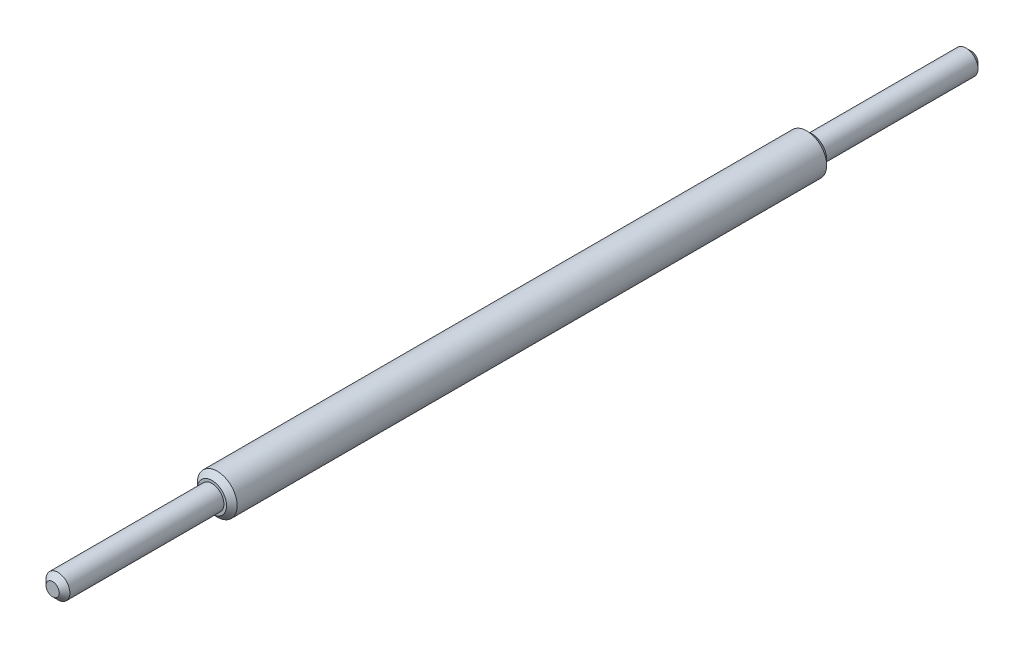
ISO-10303-21;
HEADER;
FILE_DESCRIPTION(('STEP AP214'),'2;1');
FILE_NAME('part.step','',(''),(''),'','','');
FILE_SCHEMA(('AUTOMOTIVE_DESIGN { 1 0 10303 214 1 1 1 1 }'));
ENDSEC;
DATA;
#1=APPLICATION_CONTEXT('core data for automotive mechanical design processes');
#2=APPLICATION_PROTOCOL_DEFINITION('international standard','automotive_design',2000,#1);
#3=PRODUCT_CONTEXT('',#1,'mechanical');
#4=PRODUCT('Part','Part','',(#3));
#5=PRODUCT_RELATED_PRODUCT_CATEGORY('part','',(#4));
#6=PRODUCT_DEFINITION_FORMATION('','',#4);
#7=PRODUCT_DEFINITION_CONTEXT('part definition',#1,'design');
#8=PRODUCT_DEFINITION('design','',#6,#7);
#9=PRODUCT_DEFINITION_SHAPE('','',#8);
#10=(LENGTH_UNIT() NAMED_UNIT(*) SI_UNIT(.MILLI.,.METRE.));
#11=(NAMED_UNIT(*) PLANE_ANGLE_UNIT() SI_UNIT($,.RADIAN.));
#12=(NAMED_UNIT(*) SI_UNIT($,.STERADIAN.) SOLID_ANGLE_UNIT());
#13=UNCERTAINTY_MEASURE_WITH_UNIT(LENGTH_MEASURE(1.E-05),#10,'distance_accuracy_value','');
#14=(GEOMETRIC_REPRESENTATION_CONTEXT(3) GLOBAL_UNCERTAINTY_ASSIGNED_CONTEXT((#13)) GLOBAL_UNIT_ASSIGNED_CONTEXT((#10,
#11,#12)) REPRESENTATION_CONTEXT('',''));
#15=CARTESIAN_POINT('',(0.,0.,0.));
#16=DIRECTION('',(0.,0.,1.));
#17=DIRECTION('',(1.,0.,0.));
#18=AXIS2_PLACEMENT_3D('',#15,#16,#17);
#19=CARTESIAN_POINT('',(0.,0.,173.));
#20=DIRECTION('',(0.,0.,-1.));
#21=DIRECTION('',(-1.,0.,0.));
#22=AXIS2_PLACEMENT_3D('',#19,#20,#21);
#23=CYLINDRICAL_SURFACE('',#22,4.5);
#24=CARTESIAN_POINT('',(0.,0.,171.));
#25=DIRECTION('',(0.,0.,1.));
#26=DIRECTION('',(1.,0.,0.));
#27=AXIS2_PLACEMENT_3D('',#24,#25,#26);
#28=CIRCLE('',#27,4.5);
#29=CARTESIAN_POINT('',(4.5,0.,171.));
#30=VERTEX_POINT('',#29);
#31=EDGE_CURVE('E58',#30,#30,#28,.F.);
#32=ORIENTED_EDGE('',*,*,#31,.T.);
#33=EDGE_LOOP('',(#32));
#34=FACE_BOUND('',#33,.T.);
#35=CARTESIAN_POINT('',(0.,0.,113.));
#36=DIRECTION('',(0.,0.,1.));
#37=DIRECTION('',(1.,0.,0.));
#38=AXIS2_PLACEMENT_3D('',#35,#36,#37);
#39=CIRCLE('',#38,4.5);
#40=CARTESIAN_POINT('',(4.5,0.,113.));
#41=VERTEX_POINT('',#40);
#42=EDGE_CURVE('E71',#41,#41,#39,.T.);
#43=ORIENTED_EDGE('',*,*,#42,.T.);
#44=EDGE_LOOP('',(#43));
#45=FACE_BOUND('',#44,.T.);
#46=ADVANCED_FACE('F37',(#34,#45),#23,.T.);
#47=CARTESIAN_POINT('',(0.,0.,173.));
#48=DIRECTION('',(0.,0.,1.));
#49=DIRECTION('',(1.,0.,0.));
#50=AXIS2_PLACEMENT_3D('',#47,#48,#49);
#51=PLANE('',#50);
#52=CARTESIAN_POINT('',(0.,0.,173.));
#53=DIRECTION('',(0.,0.,1.));
#54=DIRECTION('',(1.,0.,0.));
#55=AXIS2_PLACEMENT_3D('',#52,#53,#54);
#56=CIRCLE('',#55,2.5);
#57=CARTESIAN_POINT('',(2.5,0.,173.));
#58=VERTEX_POINT('',#57);
#59=EDGE_CURVE('E61',#58,#58,#56,.T.);
#60=ORIENTED_EDGE('',*,*,#59,.T.);
#61=EDGE_LOOP('',(#60));
#62=FACE_BOUND('',#61,.T.);
#63=ADVANCED_FACE('F95',(#62),#51,.T.);
#64=CARTESIAN_POINT('',(0.,0.,-194.213203435596));
#65=DIRECTION('',(0.,0.,1.));
#66=DIRECTION('',(1.,0.,0.));
#67=AXIS2_PLACEMENT_3D('',#64,#65,#66);
#68=CYLINDRICAL_SURFACE('',#67,7.5);
#69=CARTESIAN_POINT('',(0.,0.,-111.));
#70=DIRECTION('',(0.,0.,1.));
#71=DIRECTION('',(1.,0.,0.));
#72=AXIS2_PLACEMENT_3D('',#69,#70,#71);
#73=CIRCLE('',#72,7.5);
#74=CARTESIAN_POINT('',(7.5,0.,-111.));
#75=VERTEX_POINT('',#74);
#76=EDGE_CURVE('E45',#75,#75,#73,.T.);
#77=ORIENTED_EDGE('',*,*,#76,.T.);
#78=EDGE_LOOP('',(#77));
#79=FACE_BOUND('',#78,.T.);
#80=CARTESIAN_POINT('',(0.,0.,111.));
#81=DIRECTION('',(0.,0.,1.));
#82=DIRECTION('',(1.,0.,0.));
#83=AXIS2_PLACEMENT_3D('',#80,#81,#82);
#84=CIRCLE('',#83,7.5);
#85=CARTESIAN_POINT('',(7.5,0.,111.));
#86=VERTEX_POINT('',#85);
#87=EDGE_CURVE('E49',#86,#86,#84,.F.);
#88=ORIENTED_EDGE('',*,*,#87,.T.);
#89=EDGE_LOOP('',(#88));
#90=FACE_BOUND('',#89,.T.);
#91=ADVANCED_FACE('F100',(#79,#90),#68,.T.);
#92=CARTESIAN_POINT('',(0.,0.,113.));
#93=DIRECTION('',(0.,0.,1.));
#94=DIRECTION('',(1.,0.,0.));
#95=AXIS2_PLACEMENT_3D('',#92,#93,#94);
#96=PLANE('',#95);
#97=CARTESIAN_POINT('',(0.,0.,113.));
#98=DIRECTION('',(0.,0.,1.));
#99=DIRECTION('',(1.,0.,0.));
#100=AXIS2_PLACEMENT_3D('',#97,#98,#99);
#101=CIRCLE('',#100,5.49999999999992);
#102=CARTESIAN_POINT('',(5.49999999999992,0.,113.));
#103=VERTEX_POINT('',#102);
#104=EDGE_CURVE('E11',#103,#103,#101,.T.);
#105=ORIENTED_EDGE('',*,*,#104,.T.);
#106=EDGE_LOOP('',(#105));
#107=FACE_BOUND('',#106,.T.);
#108=ORIENTED_EDGE('',*,*,#42,.F.);
#109=EDGE_LOOP('',(#108));
#110=FACE_BOUND('',#109,.T.);
#111=ADVANCED_FACE('F107',(#107,#110),#96,.T.);
#112=CARTESIAN_POINT('',(0.,0.,-113.));
#113=DIRECTION('',(0.,0.,1.));
#114=DIRECTION('',(1.,0.,0.));
#115=AXIS2_PLACEMENT_3D('',#112,#113,#114);
#116=PLANE('',#115);
#117=CARTESIAN_POINT('',(0.,0.,-113.));
#118=DIRECTION('',(0.,0.,1.));
#119=DIRECTION('',(1.,0.,0.));
#120=AXIS2_PLACEMENT_3D('',#117,#118,#119);
#121=CIRCLE('',#120,5.49999999999992);
#122=CARTESIAN_POINT('',(5.49999999999992,0.,-113.));
#123=VERTEX_POINT('',#122);
#124=EDGE_CURVE('E53',#123,#123,#121,.F.);
#125=ORIENTED_EDGE('',*,*,#124,.T.);
#126=EDGE_LOOP('',(#125));
#127=FACE_BOUND('',#126,.T.);
#128=CARTESIAN_POINT('',(0.,0.,-113.));
#129=DIRECTION('',(0.,0.,1.));
#130=DIRECTION('',(1.,0.,0.));
#131=AXIS2_PLACEMENT_3D('',#128,#129,#130);
#132=CIRCLE('',#131,4.5);
#133=CARTESIAN_POINT('',(4.5,0.,-113.));
#134=VERTEX_POINT('',#133);
#135=EDGE_CURVE('E70',#134,#134,#132,.T.);
#136=ORIENTED_EDGE('',*,*,#135,.T.);
#137=EDGE_LOOP('',(#136));
#138=FACE_BOUND('',#137,.T.);
#139=ADVANCED_FACE('F77',(#127,#138),#116,.F.);
#140=CARTESIAN_POINT('',(0.,0.,-173.));
#141=DIRECTION('',(0.,0.,1.));
#142=DIRECTION('',(1.,0.,0.));
#143=AXIS2_PLACEMENT_3D('',#140,#141,#142);
#144=PLANE('',#143);
#145=CARTESIAN_POINT('',(0.,0.,-173.));
#146=DIRECTION('',(0.,0.,1.));
#147=DIRECTION('',(1.,0.,0.));
#148=AXIS2_PLACEMENT_3D('',#145,#146,#147);
#149=CIRCLE('',#148,2.49999999999992);
#150=CARTESIAN_POINT('',(2.49999999999992,0.,-173.));
#151=VERTEX_POINT('',#150);
#152=EDGE_CURVE('E64',#151,#151,#149,.F.);
#153=ORIENTED_EDGE('',*,*,#152,.T.);
#154=EDGE_LOOP('',(#153));
#155=FACE_BOUND('',#154,.T.);
#156=ADVANCED_FACE('F82',(#155),#144,.F.);
#157=CARTESIAN_POINT('',(0.,0.,-171.));
#158=DIRECTION('',(0.,0.,1.));
#159=DIRECTION('',(1.,0.,0.));
#160=AXIS2_PLACEMENT_3D('',#157,#158,#159);
#161=CIRCLE('',#160,4.5);
#162=CARTESIAN_POINT('',(4.5,0.,-171.));
#163=VERTEX_POINT('',#162);
#164=EDGE_CURVE('E67',#163,#163,#161,.T.);
#165=ORIENTED_EDGE('',*,*,#164,.T.);
#166=EDGE_LOOP('',(#165));
#167=FACE_BOUND('',#166,.T.);
#168=ORIENTED_EDGE('',*,*,#135,.F.);
#169=EDGE_LOOP('',(#168));
#170=FACE_BOUND('',#169,.T.);
#171=ADVANCED_FACE('F79',(#167,#170),#23,.T.);
#172=CARTESIAN_POINT('',(0.,0.,-171.));
#173=DIRECTION('',(0.,0.,1.));
#174=DIRECTION('',(1.,0.,0.));
#175=AXIS2_PLACEMENT_3D('',#172,#173,#174);
#176=CONICAL_SURFACE('',#175,4.5,0.785398163397454);
#177=ORIENTED_EDGE('',*,*,#152,.F.);
#178=EDGE_LOOP('',(#177));
#179=FACE_BOUND('',#178,.T.);
#180=ORIENTED_EDGE('',*,*,#164,.F.);
#181=EDGE_LOOP('',(#180));
#182=FACE_BOUND('',#181,.T.);
#183=ADVANCED_FACE('F81',(#179,#182),#176,.T.);
#184=CARTESIAN_POINT('',(0.,0.,173.));
#185=DIRECTION('',(0.,0.,-1.));
#186=DIRECTION('',(-1.,0.,0.));
#187=AXIS2_PLACEMENT_3D('',#184,#185,#186);
#188=CONICAL_SURFACE('',#187,2.5,0.785398163397447);
#189=ORIENTED_EDGE('',*,*,#31,.F.);
#190=EDGE_LOOP('',(#189));
#191=FACE_BOUND('',#190,.T.);
#192=ORIENTED_EDGE('',*,*,#59,.F.);
#193=EDGE_LOOP('',(#192));
#194=FACE_BOUND('',#193,.T.);
#195=ADVANCED_FACE('F89',(#191,#194),#188,.T.);
#196=CARTESIAN_POINT('',(0.,0.,-113.));
#197=DIRECTION('',(0.,0.,1.));
#198=DIRECTION('',(1.,0.,0.));
#199=AXIS2_PLACEMENT_3D('',#196,#197,#198);
#200=CONICAL_SURFACE('',#199,5.49999999999992,0.78539816339745);
#201=ORIENTED_EDGE('',*,*,#76,.F.);
#202=EDGE_LOOP('',(#201));
#203=FACE_BOUND('',#202,.T.);
#204=ORIENTED_EDGE('',*,*,#124,.F.);
#205=EDGE_LOOP('',(#204));
#206=FACE_BOUND('',#205,.T.);
#207=ADVANCED_FACE('F124',(#203,#206),#200,.T.);
#208=CARTESIAN_POINT('',(0.,0.,113.));
#209=DIRECTION('',(0.,0.,-1.));
#210=DIRECTION('',(-1.,0.,0.));
#211=AXIS2_PLACEMENT_3D('',#208,#209,#210);
#212=CONICAL_SURFACE('',#211,5.49999999999992,0.785398163397454);
#213=ORIENTED_EDGE('',*,*,#87,.F.);
#214=EDGE_LOOP('',(#213));
#215=FACE_BOUND('',#214,.T.);
#216=ORIENTED_EDGE('',*,*,#104,.F.);
#217=EDGE_LOOP('',(#216));
#218=FACE_BOUND('',#217,.T.);
#219=ADVANCED_FACE('F40',(#215,#218),#212,.T.);
#220=CLOSED_SHELL('',(#46,#63,#91,#111,#139,#156,#171,#183,#195,#207,#219));
#221=MANIFOLD_SOLID_BREP('B2',#220);
#222=ADVANCED_BREP_SHAPE_REPRESENTATION('',(#18,#221),#14);
#223=SHAPE_DEFINITION_REPRESENTATION(#9,#222);
ENDSEC;
END-ISO-10303-21;
